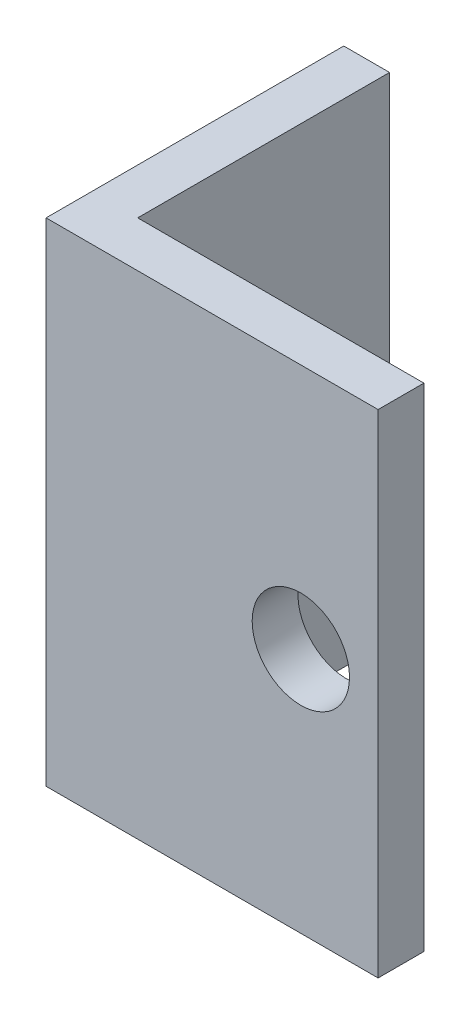
ISO-10303-21;
HEADER;
FILE_DESCRIPTION(('STEP AP214'),'2;1');
FILE_NAME('part.step','',(''),(''),'','','');
FILE_SCHEMA(('AUTOMOTIVE_DESIGN { 1 0 10303 214 1 1 1 1 }'));
ENDSEC;
DATA;
#1=APPLICATION_CONTEXT('core data for automotive mechanical design processes');
#2=APPLICATION_PROTOCOL_DEFINITION('international standard','automotive_design',2000,#1);
#3=PRODUCT_CONTEXT('',#1,'mechanical');
#4=PRODUCT('Part','Part','',(#3));
#5=PRODUCT_RELATED_PRODUCT_CATEGORY('part','',(#4));
#6=PRODUCT_DEFINITION_FORMATION('','',#4);
#7=PRODUCT_DEFINITION_CONTEXT('part definition',#1,'design');
#8=PRODUCT_DEFINITION('design','',#6,#7);
#9=PRODUCT_DEFINITION_SHAPE('','',#8);
#10=(LENGTH_UNIT() NAMED_UNIT(*) SI_UNIT(.MILLI.,.METRE.));
#11=(NAMED_UNIT(*) PLANE_ANGLE_UNIT() SI_UNIT($,.RADIAN.));
#12=(NAMED_UNIT(*) SI_UNIT($,.STERADIAN.) SOLID_ANGLE_UNIT());
#13=UNCERTAINTY_MEASURE_WITH_UNIT(LENGTH_MEASURE(1.E-05),#10,'distance_accuracy_value','');
#14=(GEOMETRIC_REPRESENTATION_CONTEXT(3) GLOBAL_UNCERTAINTY_ASSIGNED_CONTEXT((#13)) GLOBAL_UNIT_ASSIGNED_CONTEXT((#10,
#11,#12)) REPRESENTATION_CONTEXT('',''));
#15=CARTESIAN_POINT('',(0.,0.,0.));
#16=DIRECTION('',(0.,0.,1.));
#17=DIRECTION('',(1.,0.,0.));
#18=AXIS2_PLACEMENT_3D('',#15,#16,#17);
#19=CARTESIAN_POINT('',(25.,195.,0.));
#20=DIRECTION('',(-1.,0.,0.));
#21=DIRECTION('',(0.,0.,1.));
#22=AXIS2_PLACEMENT_3D('',#19,#20,#21);
#23=PLANE('',#22);
#24=DIRECTION('',(0.,1.,0.));
#25=VECTOR('',#24,1.);
#26=CARTESIAN_POINT('',(25.,195.,4.));
#27=LINE('',#26,#25);
#28=CARTESIAN_POINT('',(25.,152.,4.));
#29=VERTEX_POINT('',#28);
#30=CARTESIAN_POINT('',(25.,195.,4.));
#31=VERTEX_POINT('',#30);
#32=EDGE_CURVE('E117',#29,#31,#27,.T.);
#33=ORIENTED_EDGE('',*,*,#32,.F.);
#34=DIRECTION('',(0.,0.,1.));
#35=VECTOR('',#34,1.);
#36=CARTESIAN_POINT('',(25.,152.,-36.));
#37=LINE('',#36,#35);
#38=CARTESIAN_POINT('',(25.,152.,0.));
#39=VERTEX_POINT('',#38);
#40=EDGE_CURVE('E52',#39,#29,#37,.T.);
#41=ORIENTED_EDGE('',*,*,#40,.F.);
#42=DIRECTION('',(0.,-1.,0.));
#43=VECTOR('',#42,1.);
#44=CARTESIAN_POINT('',(25.,195.,0.));
#45=LINE('',#44,#43);
#46=CARTESIAN_POINT('',(25.,195.,0.));
#47=VERTEX_POINT('',#46);
#48=EDGE_CURVE('E45',#47,#39,#45,.T.);
#49=ORIENTED_EDGE('',*,*,#48,.F.);
#50=DIRECTION('',(0.,0.,-1.));
#51=VECTOR('',#50,1.);
#52=CARTESIAN_POINT('',(25.,195.,0.));
#53=LINE('',#52,#51);
#54=EDGE_CURVE('E127',#31,#47,#53,.T.);
#55=ORIENTED_EDGE('',*,*,#54,.F.);
#56=EDGE_LOOP('',(#33,#41,#49,#55));
#57=FACE_BOUND('',#56,.T.);
#58=ADVANCED_FACE('F38',(#57),#23,.F.);
#59=CARTESIAN_POINT('',(0.,195.,0.));
#60=DIRECTION('',(0.,0.,1.));
#61=DIRECTION('',(1.,0.,0.));
#62=AXIS2_PLACEMENT_3D('',#59,#60,#61);
#63=PLANE('',#62);
#64=CARTESIAN_POINT('',(18.25,173.5,0.));
#65=DIRECTION('',(0.,0.,1.));
#66=DIRECTION('',(1.,0.,0.));
#67=AXIS2_PLACEMENT_3D('',#64,#65,#66);
#68=CIRCLE('',#67,4.25000000000001);
#69=CARTESIAN_POINT('',(22.5,173.5,0.));
#70=VERTEX_POINT('',#69);
#71=EDGE_CURVE('E96',#70,#70,#68,.T.);
#72=ORIENTED_EDGE('',*,*,#71,.T.);
#73=EDGE_LOOP('',(#72));
#74=FACE_BOUND('',#73,.T.);
#75=ORIENTED_EDGE('',*,*,#48,.T.);
#76=DIRECTION('',(-1.,0.,0.));
#77=VECTOR('',#76,1.);
#78=CARTESIAN_POINT('',(0.,152.,0.));
#79=LINE('',#78,#77);
#80=CARTESIAN_POINT('',(0.,152.,0.));
#81=VERTEX_POINT('',#80);
#82=EDGE_CURVE('E138',#39,#81,#79,.T.);
#83=ORIENTED_EDGE('',*,*,#82,.T.);
#84=DIRECTION('',(0.,-1.,0.));
#85=VECTOR('',#84,1.);
#86=CARTESIAN_POINT('',(0.,195.,0.));
#87=LINE('',#86,#85);
#88=CARTESIAN_POINT('',(0.,195.,0.));
#89=VERTEX_POINT('',#88);
#90=EDGE_CURVE('E131',#89,#81,#87,.T.);
#91=ORIENTED_EDGE('',*,*,#90,.F.);
#92=DIRECTION('',(-1.,0.,0.));
#93=VECTOR('',#92,1.);
#94=CARTESIAN_POINT('',(0.,195.,0.));
#95=LINE('',#94,#93);
#96=EDGE_CURVE('E60',#47,#89,#95,.T.);
#97=ORIENTED_EDGE('',*,*,#96,.F.);
#98=EDGE_LOOP('',(#75,#83,#91,#97));
#99=FACE_BOUND('',#98,.T.);
#100=ADVANCED_FACE('F137',(#74,#99),#63,.F.);
#101=CARTESIAN_POINT('',(0.,195.,0.));
#102=DIRECTION('',(0.,-1.,0.));
#103=DIRECTION('',(0.,0.,-1.));
#104=AXIS2_PLACEMENT_3D('',#101,#102,#103);
#105=PLANE('',#104);
#106=ORIENTED_EDGE('',*,*,#96,.T.);
#107=DIRECTION('',(0.,0.,-1.));
#108=VECTOR('',#107,1.);
#109=CARTESIAN_POINT('',(0.,195.,3.));
#110=LINE('',#109,#108);
#111=CARTESIAN_POINT('',(0.,195.,-22.));
#112=VERTEX_POINT('',#111);
#113=EDGE_CURVE('E113',#89,#112,#110,.T.);
#114=ORIENTED_EDGE('',*,*,#113,.T.);
#115=DIRECTION('',(-1.,0.,0.));
#116=VECTOR('',#115,1.);
#117=CARTESIAN_POINT('',(0.,195.,-22.));
#118=LINE('',#117,#116);
#119=CARTESIAN_POINT('',(-4.,195.,-22.));
#120=VERTEX_POINT('',#119);
#121=EDGE_CURVE('E115',#112,#120,#118,.T.);
#122=ORIENTED_EDGE('',*,*,#121,.T.);
#123=DIRECTION('',(0.,0.,1.));
#124=VECTOR('',#123,1.);
#125=CARTESIAN_POINT('',(-4.,195.,3.));
#126=LINE('',#125,#124);
#127=CARTESIAN_POINT('',(-4.,195.,4.));
#128=VERTEX_POINT('',#127);
#129=EDGE_CURVE('E123',#120,#128,#126,.T.);
#130=ORIENTED_EDGE('',*,*,#129,.T.);
#131=DIRECTION('',(-1.,0.,0.));
#132=VECTOR('',#131,1.);
#133=CARTESIAN_POINT('',(25.,195.,4.));
#134=LINE('',#133,#132);
#135=EDGE_CURVE('E112',#31,#128,#134,.T.);
#136=ORIENTED_EDGE('',*,*,#135,.F.);
#137=ORIENTED_EDGE('',*,*,#54,.T.);
#138=EDGE_LOOP('',(#106,#114,#122,#130,#136,#137));
#139=FACE_BOUND('',#138,.T.);
#140=ADVANCED_FACE('F154',(#139),#105,.F.);
#141=CARTESIAN_POINT('',(0.,0.,3.));
#142=DIRECTION('',(1.,0.,0.));
#143=DIRECTION('',(0.,0.,-1.));
#144=AXIS2_PLACEMENT_3D('',#141,#142,#143);
#145=PLANE('',#144);
#146=DIRECTION('',(0.,0.,1.));
#147=VECTOR('',#146,1.);
#148=CARTESIAN_POINT('',(0.,152.,3.));
#149=LINE('',#148,#147);
#150=CARTESIAN_POINT('',(0.,152.,-22.));
#151=VERTEX_POINT('',#150);
#152=EDGE_CURVE('E105',#151,#81,#149,.T.);
#153=ORIENTED_EDGE('',*,*,#152,.F.);
#154=DIRECTION('',(0.,1.,0.));
#155=VECTOR('',#154,1.);
#156=CARTESIAN_POINT('',(0.,0.,-22.));
#157=LINE('',#156,#155);
#158=EDGE_CURVE('E125',#151,#112,#157,.T.);
#159=ORIENTED_EDGE('',*,*,#158,.T.);
#160=ORIENTED_EDGE('',*,*,#113,.F.);
#161=ORIENTED_EDGE('',*,*,#90,.T.);
#162=EDGE_LOOP('',(#153,#159,#160,#161));
#163=FACE_BOUND('',#162,.T.);
#164=ADVANCED_FACE('F149',(#163),#145,.T.);
#165=CARTESIAN_POINT('',(-4.,0.,3.));
#166=DIRECTION('',(-1.,0.,0.));
#167=DIRECTION('',(0.,0.,1.));
#168=AXIS2_PLACEMENT_3D('',#165,#166,#167);
#169=PLANE('',#168);
#170=DIRECTION('',(0.,0.,-1.));
#171=VECTOR('',#170,1.);
#172=CARTESIAN_POINT('',(-4.,152.,3.));
#173=LINE('',#172,#171);
#174=CARTESIAN_POINT('',(-4.,152.,4.));
#175=VERTEX_POINT('',#174);
#176=CARTESIAN_POINT('',(-4.,152.,-22.));
#177=VERTEX_POINT('',#176);
#178=EDGE_CURVE('E91',#175,#177,#173,.T.);
#179=ORIENTED_EDGE('',*,*,#178,.F.);
#180=DIRECTION('',(0.,-1.,0.));
#181=VECTOR('',#180,1.);
#182=CARTESIAN_POINT('',(-4.,195.,4.));
#183=LINE('',#182,#181);
#184=EDGE_CURVE('E103',#128,#175,#183,.T.);
#185=ORIENTED_EDGE('',*,*,#184,.F.);
#186=ORIENTED_EDGE('',*,*,#129,.F.);
#187=DIRECTION('',(0.,1.,0.));
#188=VECTOR('',#187,1.);
#189=CARTESIAN_POINT('',(-4.,0.,-22.));
#190=LINE('',#189,#188);
#191=EDGE_CURVE('E104',#177,#120,#190,.T.);
#192=ORIENTED_EDGE('',*,*,#191,.F.);
#193=EDGE_LOOP('',(#179,#185,#186,#192));
#194=FACE_BOUND('',#193,.T.);
#195=ADVANCED_FACE('F101',(#194),#169,.T.);
#196=CARTESIAN_POINT('',(0.,0.,-22.));
#197=DIRECTION('',(0.,0.,-1.));
#198=DIRECTION('',(-1.,0.,0.));
#199=AXIS2_PLACEMENT_3D('',#196,#197,#198);
#200=PLANE('',#199);
#201=DIRECTION('',(1.,0.,0.));
#202=VECTOR('',#201,1.);
#203=CARTESIAN_POINT('',(0.,152.,-22.));
#204=LINE('',#203,#202);
#205=EDGE_CURVE('E106',#177,#151,#204,.T.);
#206=ORIENTED_EDGE('',*,*,#205,.F.);
#207=ORIENTED_EDGE('',*,*,#191,.T.);
#208=ORIENTED_EDGE('',*,*,#121,.F.);
#209=ORIENTED_EDGE('',*,*,#158,.F.);
#210=EDGE_LOOP('',(#206,#207,#208,#209));
#211=FACE_BOUND('',#210,.T.);
#212=ADVANCED_FACE('F153',(#211),#200,.T.);
#213=CARTESIAN_POINT('',(0.,0.,4.));
#214=DIRECTION('',(0.,0.,-1.));
#215=DIRECTION('',(-1.,0.,0.));
#216=AXIS2_PLACEMENT_3D('',#213,#214,#215);
#217=PLANE('',#216);
#218=ORIENTED_EDGE('',*,*,#184,.T.);
#219=DIRECTION('',(-1.,0.,0.));
#220=VECTOR('',#219,1.);
#221=CARTESIAN_POINT('',(25.,152.,4.));
#222=LINE('',#221,#220);
#223=EDGE_CURVE('E88',#29,#175,#222,.T.);
#224=ORIENTED_EDGE('',*,*,#223,.F.);
#225=ORIENTED_EDGE('',*,*,#32,.T.);
#226=ORIENTED_EDGE('',*,*,#135,.T.);
#227=EDGE_LOOP('',(#218,#224,#225,#226));
#228=FACE_BOUND('',#227,.T.);
#229=CARTESIAN_POINT('',(18.25,173.5,4.));
#230=DIRECTION('',(0.,0.,-1.));
#231=DIRECTION('',(-1.,0.,0.));
#232=AXIS2_PLACEMENT_3D('',#229,#230,#231);
#233=CIRCLE('',#232,4.25000000000001);
#234=CARTESIAN_POINT('',(14.,173.5,4.));
#235=VERTEX_POINT('',#234);
#236=EDGE_CURVE('E11',#235,#235,#233,.T.);
#237=ORIENTED_EDGE('',*,*,#236,.T.);
#238=EDGE_LOOP('',(#237));
#239=FACE_BOUND('',#238,.T.);
#240=ADVANCED_FACE('F109',(#228,#239),#217,.F.);
#241=CARTESIAN_POINT('',(25.,152.,-36.));
#242=DIRECTION('',(0.,1.,0.));
#243=DIRECTION('',(-1.,0.,0.));
#244=AXIS2_PLACEMENT_3D('',#241,#242,#243);
#245=PLANE('',#244);
#246=ORIENTED_EDGE('',*,*,#40,.T.);
#247=ORIENTED_EDGE('',*,*,#223,.T.);
#248=ORIENTED_EDGE('',*,*,#178,.T.);
#249=ORIENTED_EDGE('',*,*,#205,.T.);
#250=ORIENTED_EDGE('',*,*,#152,.T.);
#251=ORIENTED_EDGE('',*,*,#82,.F.);
#252=EDGE_LOOP('',(#246,#247,#248,#249,#250,#251));
#253=FACE_BOUND('',#252,.T.);
#254=ADVANCED_FACE('F90',(#253),#245,.F.);
#255=CARTESIAN_POINT('',(18.25,173.5,-36.));
#256=DIRECTION('',(0.,0.,1.));
#257=DIRECTION('',(1.,0.,0.));
#258=AXIS2_PLACEMENT_3D('',#255,#256,#257);
#259=CYLINDRICAL_SURFACE('',#258,4.25000000000001);
#260=ORIENTED_EDGE('',*,*,#71,.F.);
#261=EDGE_LOOP('',(#260));
#262=FACE_BOUND('',#261,.T.);
#263=ORIENTED_EDGE('',*,*,#236,.F.);
#264=EDGE_LOOP('',(#263));
#265=FACE_BOUND('',#264,.T.);
#266=ADVANCED_FACE('F194',(#262,#265),#259,.F.);
#267=CLOSED_SHELL('',(#58,#100,#140,#164,#195,#212,#240,#254,#266));
#268=MANIFOLD_SOLID_BREP('B2',#267);
#269=ADVANCED_BREP_SHAPE_REPRESENTATION('',(#18,#268),#14);
#270=SHAPE_DEFINITION_REPRESENTATION(#9,#269);
ENDSEC;
END-ISO-10303-21;
